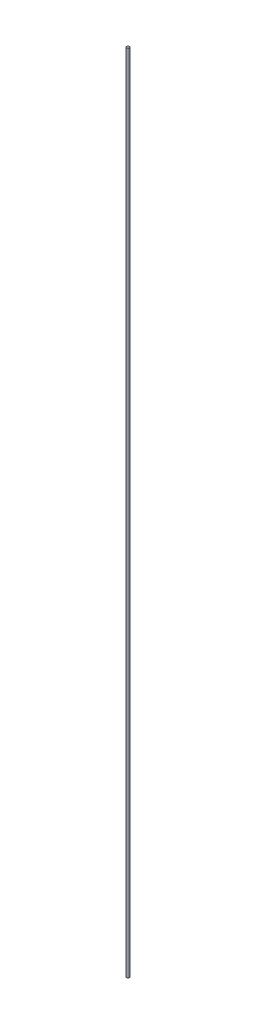
ISO-10303-21;
HEADER;
FILE_DESCRIPTION(('STEP AP214'),'2;1');
FILE_NAME('part.step','',(''),(''),'','','');
FILE_SCHEMA(('AUTOMOTIVE_DESIGN { 1 0 10303 214 1 1 1 1 }'));
ENDSEC;
DATA;
#1=APPLICATION_CONTEXT('core data for automotive mechanical design processes');
#2=APPLICATION_PROTOCOL_DEFINITION('international standard','automotive_design',2000,#1);
#3=PRODUCT_CONTEXT('',#1,'mechanical');
#4=PRODUCT('Part','Part','',(#3));
#5=PRODUCT_RELATED_PRODUCT_CATEGORY('part','',(#4));
#6=PRODUCT_DEFINITION_FORMATION('','',#4);
#7=PRODUCT_DEFINITION_CONTEXT('part definition',#1,'design');
#8=PRODUCT_DEFINITION('design','',#6,#7);
#9=PRODUCT_DEFINITION_SHAPE('','',#8);
#10=(LENGTH_UNIT() NAMED_UNIT(*) SI_UNIT(.MILLI.,.METRE.));
#11=(NAMED_UNIT(*) PLANE_ANGLE_UNIT() SI_UNIT($,.RADIAN.));
#12=(NAMED_UNIT(*) SI_UNIT($,.STERADIAN.) SOLID_ANGLE_UNIT());
#13=UNCERTAINTY_MEASURE_WITH_UNIT(LENGTH_MEASURE(1.E-05),#10,'distance_accuracy_value','');
#14=(GEOMETRIC_REPRESENTATION_CONTEXT(3) GLOBAL_UNCERTAINTY_ASSIGNED_CONTEXT((#13)) GLOBAL_UNIT_ASSIGNED_CONTEXT((#10,
#11,#12)) REPRESENTATION_CONTEXT('',''));
#15=CARTESIAN_POINT('',(0.,0.,0.));
#16=DIRECTION('',(0.,0.,1.));
#17=DIRECTION('',(1.,0.,0.));
#18=AXIS2_PLACEMENT_3D('',#15,#16,#17);
#19=CARTESIAN_POINT('',(0.,1500.,0.));
#20=DIRECTION('',(0.,-1.,0.));
#21=DIRECTION('',(0.,0.,-1.));
#22=AXIS2_PLACEMENT_3D('',#19,#20,#21);
#23=CYLINDRICAL_SURFACE('',#22,2.5);
#24=CARTESIAN_POINT('',(0.,1500.,0.));
#25=DIRECTION('',(0.,1.,0.));
#26=DIRECTION('',(0.,0.,1.));
#27=AXIS2_PLACEMENT_3D('',#24,#25,#26);
#28=CIRCLE('',#27,2.5);
#29=CARTESIAN_POINT('',(0.,1500.,2.5));
#30=VERTEX_POINT('',#29);
#31=EDGE_CURVE('E10',#30,#30,#28,.T.);
#32=ORIENTED_EDGE('',*,*,#31,.F.);
#33=EDGE_LOOP('',(#32));
#34=FACE_BOUND('',#33,.T.);
#35=CARTESIAN_POINT('',(0.,0.,0.));
#36=DIRECTION('',(0.,1.,0.));
#37=DIRECTION('',(0.,0.,1.));
#38=AXIS2_PLACEMENT_3D('',#35,#36,#37);
#39=CIRCLE('',#38,2.5);
#40=CARTESIAN_POINT('',(0.,0.,2.5));
#41=VERTEX_POINT('',#40);
#42=EDGE_CURVE('E34',#41,#41,#39,.T.);
#43=ORIENTED_EDGE('',*,*,#42,.T.);
#44=EDGE_LOOP('',(#43));
#45=FACE_BOUND('',#44,.T.);
#46=ADVANCED_FACE('F31',(#34,#45),#23,.T.);
#47=CARTESIAN_POINT('',(0.,1500.,0.));
#48=DIRECTION('',(0.,1.,0.));
#49=DIRECTION('',(0.,0.,1.));
#50=AXIS2_PLACEMENT_3D('',#47,#48,#49);
#51=PLANE('',#50);
#52=ORIENTED_EDGE('',*,*,#31,.T.);
#53=EDGE_LOOP('',(#52));
#54=FACE_BOUND('',#53,.T.);
#55=ADVANCED_FACE('F46',(#54),#51,.T.);
#56=CARTESIAN_POINT('',(0.,0.,0.));
#57=DIRECTION('',(0.,1.,0.));
#58=DIRECTION('',(0.,0.,1.));
#59=AXIS2_PLACEMENT_3D('',#56,#57,#58);
#60=PLANE('',#59);
#61=ORIENTED_EDGE('',*,*,#42,.F.);
#62=EDGE_LOOP('',(#61));
#63=FACE_BOUND('',#62,.T.);
#64=ADVANCED_FACE('F44',(#63),#60,.F.);
#65=CLOSED_SHELL('',(#46,#55,#64));
#66=MANIFOLD_SOLID_BREP('B2',#65);
#67=ADVANCED_BREP_SHAPE_REPRESENTATION('',(#18,#66),#14);
#68=SHAPE_DEFINITION_REPRESENTATION(#9,#67);
ENDSEC;
END-ISO-10303-21;
